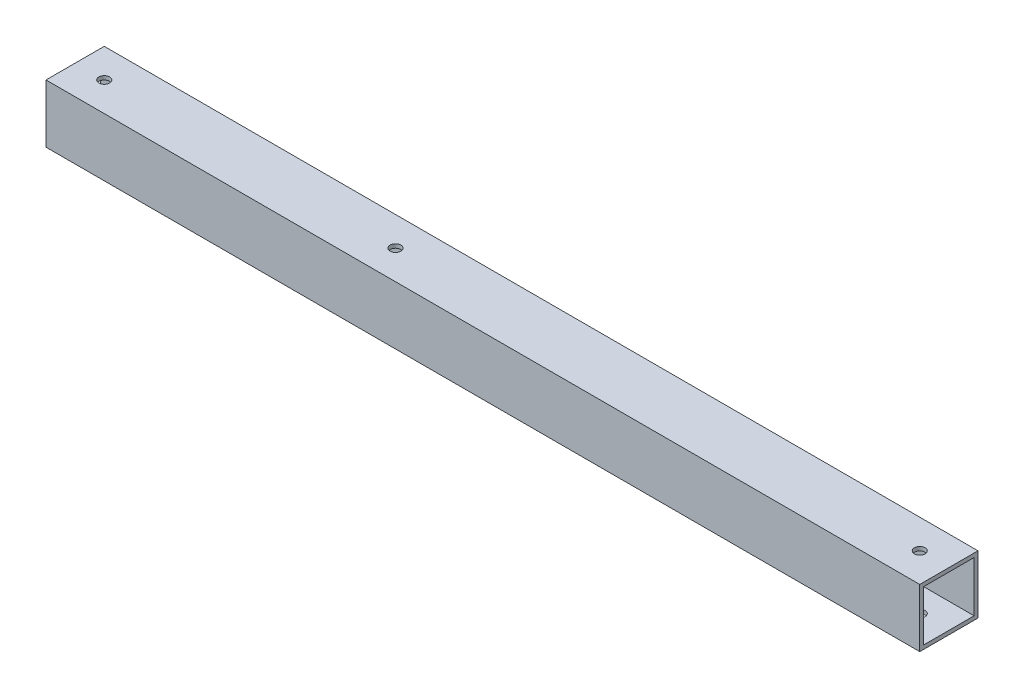
ISO-10303-21;
HEADER;
FILE_DESCRIPTION(('STEP AP214'),'2;1');
FILE_NAME('part.step','',(''),(''),'','','');
FILE_SCHEMA(('AUTOMOTIVE_DESIGN { 1 0 10303 214 1 1 1 1 }'));
ENDSEC;
DATA;
#1=APPLICATION_CONTEXT('core data for automotive mechanical design processes');
#2=APPLICATION_PROTOCOL_DEFINITION('international standard','automotive_design',2000,#1);
#3=PRODUCT_CONTEXT('',#1,'mechanical');
#4=PRODUCT('Part','Part','',(#3));
#5=PRODUCT_RELATED_PRODUCT_CATEGORY('part','',(#4));
#6=PRODUCT_DEFINITION_FORMATION('','',#4);
#7=PRODUCT_DEFINITION_CONTEXT('part definition',#1,'design');
#8=PRODUCT_DEFINITION('design','',#6,#7);
#9=PRODUCT_DEFINITION_SHAPE('','',#8);
#10=(LENGTH_UNIT() NAMED_UNIT(*) SI_UNIT(.MILLI.,.METRE.));
#11=(NAMED_UNIT(*) PLANE_ANGLE_UNIT() SI_UNIT($,.RADIAN.));
#12=(NAMED_UNIT(*) SI_UNIT($,.STERADIAN.) SOLID_ANGLE_UNIT());
#13=UNCERTAINTY_MEASURE_WITH_UNIT(LENGTH_MEASURE(1.E-05),#10,'distance_accuracy_value','');
#14=(GEOMETRIC_REPRESENTATION_CONTEXT(3) GLOBAL_UNCERTAINTY_ASSIGNED_CONTEXT((#13)) GLOBAL_UNIT_ASSIGNED_CONTEXT((#10,
#11,#12)) REPRESENTATION_CONTEXT('',''));
#15=CARTESIAN_POINT('',(0.,0.,0.));
#16=DIRECTION('',(0.,0.,1.));
#17=DIRECTION('',(1.,0.,0.));
#18=AXIS2_PLACEMENT_3D('',#15,#16,#17);
#19=CARTESIAN_POINT('',(225.,0.,0.));
#20=DIRECTION('',(-1.,0.,0.));
#21=DIRECTION('',(0.,0.,1.));
#22=AXIS2_PLACEMENT_3D('',#19,#20,#21);
#23=PLANE('',#22);
#24=DIRECTION('',(0.,-1.,0.));
#25=VECTOR('',#24,1.);
#26=CARTESIAN_POINT('',(225.,15.,15.));
#27=LINE('',#26,#25);
#28=CARTESIAN_POINT('',(225.,15.,15.));
#29=VERTEX_POINT('',#28);
#30=CARTESIAN_POINT('',(225.,-15.,15.));
#31=VERTEX_POINT('',#30);
#32=EDGE_CURVE('E156',#29,#31,#27,.T.);
#33=ORIENTED_EDGE('',*,*,#32,.T.);
#34=DIRECTION('',(0.,0.,-1.));
#35=VECTOR('',#34,1.);
#36=CARTESIAN_POINT('',(225.,-15.,-15.));
#37=LINE('',#36,#35);
#38=CARTESIAN_POINT('',(225.,-15.,-15.));
#39=VERTEX_POINT('',#38);
#40=EDGE_CURVE('E160',#31,#39,#37,.T.);
#41=ORIENTED_EDGE('',*,*,#40,.T.);
#42=DIRECTION('',(0.,1.,0.));
#43=VECTOR('',#42,1.);
#44=CARTESIAN_POINT('',(225.,15.,-15.));
#45=LINE('',#44,#43);
#46=CARTESIAN_POINT('',(225.,15.,-15.));
#47=VERTEX_POINT('',#46);
#48=EDGE_CURVE('E164',#39,#47,#45,.T.);
#49=ORIENTED_EDGE('',*,*,#48,.T.);
#50=DIRECTION('',(0.,0.,1.));
#51=VECTOR('',#50,1.);
#52=CARTESIAN_POINT('',(225.,15.,-15.));
#53=LINE('',#52,#51);
#54=EDGE_CURVE('E167',#47,#29,#53,.T.);
#55=ORIENTED_EDGE('',*,*,#54,.T.);
#56=EDGE_LOOP('',(#33,#41,#49,#55));
#57=FACE_BOUND('',#56,.T.);
#58=DIRECTION('',(0.,1.,0.));
#59=VECTOR('',#58,1.);
#60=CARTESIAN_POINT('',(225.,13.,-13.));
#61=LINE('',#60,#59);
#62=CARTESIAN_POINT('',(225.,-13.,-13.));
#63=VERTEX_POINT('',#62);
#64=CARTESIAN_POINT('',(225.,13.,-13.));
#65=VERTEX_POINT('',#64);
#66=EDGE_CURVE('E106',#63,#65,#61,.T.);
#67=ORIENTED_EDGE('',*,*,#66,.F.);
#68=DIRECTION('',(0.,0.,-1.));
#69=VECTOR('',#68,1.);
#70=CARTESIAN_POINT('',(225.,-13.,13.));
#71=LINE('',#70,#69);
#72=CARTESIAN_POINT('',(225.,-13.,13.));
#73=VERTEX_POINT('',#72);
#74=EDGE_CURVE('E132',#73,#63,#71,.T.);
#75=ORIENTED_EDGE('',*,*,#74,.F.);
#76=DIRECTION('',(0.,-1.,0.));
#77=VECTOR('',#76,1.);
#78=CARTESIAN_POINT('',(225.,13.,13.));
#79=LINE('',#78,#77);
#80=CARTESIAN_POINT('',(225.,13.,13.));
#81=VERTEX_POINT('',#80);
#82=EDGE_CURVE('E128',#81,#73,#79,.T.);
#83=ORIENTED_EDGE('',*,*,#82,.F.);
#84=DIRECTION('',(0.,0.,1.));
#85=VECTOR('',#84,1.);
#86=CARTESIAN_POINT('',(225.,13.,13.));
#87=LINE('',#86,#85);
#88=EDGE_CURVE('E115',#65,#81,#87,.T.);
#89=ORIENTED_EDGE('',*,*,#88,.F.);
#90=EDGE_LOOP('',(#67,#75,#83,#89));
#91=FACE_BOUND('',#90,.T.);
#92=ADVANCED_FACE('F38',(#57,#91),#23,.F.);
#93=CARTESIAN_POINT('',(-225.,0.,0.));
#94=DIRECTION('',(-1.,0.,0.));
#95=DIRECTION('',(0.,0.,1.));
#96=AXIS2_PLACEMENT_3D('',#93,#94,#95);
#97=PLANE('',#96);
#98=DIRECTION('',(0.,-1.,0.));
#99=VECTOR('',#98,1.);
#100=CARTESIAN_POINT('',(-225.,15.,15.));
#101=LINE('',#100,#99);
#102=CARTESIAN_POINT('',(-225.,15.,15.));
#103=VERTEX_POINT('',#102);
#104=CARTESIAN_POINT('',(-225.,-15.,15.));
#105=VERTEX_POINT('',#104);
#106=EDGE_CURVE('E124',#103,#105,#101,.T.);
#107=ORIENTED_EDGE('',*,*,#106,.F.);
#108=DIRECTION('',(0.,0.,1.));
#109=VECTOR('',#108,1.);
#110=CARTESIAN_POINT('',(-225.,15.,-15.));
#111=LINE('',#110,#109);
#112=CARTESIAN_POINT('',(-225.,15.,-15.));
#113=VERTEX_POINT('',#112);
#114=EDGE_CURVE('E161',#113,#103,#111,.T.);
#115=ORIENTED_EDGE('',*,*,#114,.F.);
#116=DIRECTION('',(0.,1.,0.));
#117=VECTOR('',#116,1.);
#118=CARTESIAN_POINT('',(-225.,15.,-15.));
#119=LINE('',#118,#117);
#120=CARTESIAN_POINT('',(-225.,-15.,-15.));
#121=VERTEX_POINT('',#120);
#122=EDGE_CURVE('E177',#121,#113,#119,.T.);
#123=ORIENTED_EDGE('',*,*,#122,.F.);
#124=DIRECTION('',(0.,0.,-1.));
#125=VECTOR('',#124,1.);
#126=CARTESIAN_POINT('',(-225.,-15.,-15.));
#127=LINE('',#126,#125);
#128=EDGE_CURVE('E174',#105,#121,#127,.T.);
#129=ORIENTED_EDGE('',*,*,#128,.F.);
#130=EDGE_LOOP('',(#107,#115,#123,#129));
#131=FACE_BOUND('',#130,.T.);
#132=DIRECTION('',(0.,0.,-1.));
#133=VECTOR('',#132,1.);
#134=CARTESIAN_POINT('',(-225.,-13.,13.));
#135=LINE('',#134,#133);
#136=CARTESIAN_POINT('',(-225.,-13.,13.));
#137=VERTEX_POINT('',#136);
#138=CARTESIAN_POINT('',(-225.,-13.,-13.));
#139=VERTEX_POINT('',#138);
#140=EDGE_CURVE('E116',#137,#139,#135,.T.);
#141=ORIENTED_EDGE('',*,*,#140,.T.);
#142=DIRECTION('',(0.,1.,0.));
#143=VECTOR('',#142,1.);
#144=CARTESIAN_POINT('',(-225.,13.,-13.));
#145=LINE('',#144,#143);
#146=CARTESIAN_POINT('',(-225.,13.,-13.));
#147=VERTEX_POINT('',#146);
#148=EDGE_CURVE('E64',#139,#147,#145,.T.);
#149=ORIENTED_EDGE('',*,*,#148,.T.);
#150=DIRECTION('',(0.,0.,1.));
#151=VECTOR('',#150,1.);
#152=CARTESIAN_POINT('',(-225.,13.,13.));
#153=LINE('',#152,#151);
#154=CARTESIAN_POINT('',(-225.,13.,13.));
#155=VERTEX_POINT('',#154);
#156=EDGE_CURVE('E122',#147,#155,#153,.T.);
#157=ORIENTED_EDGE('',*,*,#156,.T.);
#158=DIRECTION('',(0.,-1.,0.));
#159=VECTOR('',#158,1.);
#160=CARTESIAN_POINT('',(-225.,13.,13.));
#161=LINE('',#160,#159);
#162=EDGE_CURVE('E143',#155,#137,#161,.T.);
#163=ORIENTED_EDGE('',*,*,#162,.T.);
#164=EDGE_LOOP('',(#141,#149,#157,#163));
#165=FACE_BOUND('',#164,.T.);
#166=ADVANCED_FACE('F249',(#131,#165),#97,.T.);
#167=CARTESIAN_POINT('',(225.,15.,15.));
#168=DIRECTION('',(0.,0.,-1.));
#169=DIRECTION('',(0.,1.,0.));
#170=AXIS2_PLACEMENT_3D('',#167,#168,#169);
#171=PLANE('',#170);
#172=ORIENTED_EDGE('',*,*,#106,.T.);
#173=DIRECTION('',(-1.,0.,0.));
#174=VECTOR('',#173,1.);
#175=CARTESIAN_POINT('',(225.,-15.,15.));
#176=LINE('',#175,#174);
#177=EDGE_CURVE('E11',#31,#105,#176,.T.);
#178=ORIENTED_EDGE('',*,*,#177,.F.);
#179=ORIENTED_EDGE('',*,*,#32,.F.);
#180=DIRECTION('',(-1.,0.,0.));
#181=VECTOR('',#180,1.);
#182=CARTESIAN_POINT('',(225.,15.,15.));
#183=LINE('',#182,#181);
#184=EDGE_CURVE('E170',#29,#103,#183,.T.);
#185=ORIENTED_EDGE('',*,*,#184,.T.);
#186=EDGE_LOOP('',(#172,#178,#179,#185));
#187=FACE_BOUND('',#186,.T.);
#188=ADVANCED_FACE('F40',(#187),#171,.F.);
#189=CARTESIAN_POINT('',(225.,-15.,-15.));
#190=DIRECTION('',(0.,1.,0.));
#191=DIRECTION('',(0.,0.,1.));
#192=AXIS2_PLACEMENT_3D('',#189,#190,#191);
#193=PLANE('',#192);
#194=CARTESIAN_POINT('',(-60.,-15.,0.));
#195=DIRECTION('',(0.,1.,0.));
#196=DIRECTION('',(0.,0.,1.));
#197=AXIS2_PLACEMENT_3D('',#194,#195,#196);
#198=CIRCLE('',#197,2.74999999999999);
#199=CARTESIAN_POINT('',(-60.,-15.,2.74999999999999));
#200=VERTEX_POINT('',#199);
#201=EDGE_CURVE('E274',#200,#200,#198,.T.);
#202=ORIENTED_EDGE('',*,*,#201,.T.);
#203=EDGE_LOOP('',(#202));
#204=FACE_BOUND('',#203,.T.);
#205=CARTESIAN_POINT('',(-210.,-15.,0.));
#206=DIRECTION('',(0.,-1.,0.));
#207=DIRECTION('',(0.,0.,1.));
#208=AXIS2_PLACEMENT_3D('',#205,#206,#207);
#209=CIRCLE('',#208,2.75000000000001);
#210=CARTESIAN_POINT('',(-210.,-15.,2.75000000000001));
#211=VERTEX_POINT('',#210);
#212=EDGE_CURVE('E200',#211,#211,#209,.T.);
#213=ORIENTED_EDGE('',*,*,#212,.F.);
#214=EDGE_LOOP('',(#213));
#215=FACE_BOUND('',#214,.T.);
#216=CARTESIAN_POINT('',(210.,-15.,0.));
#217=DIRECTION('',(0.,1.,0.));
#218=DIRECTION('',(0.,0.,1.));
#219=AXIS2_PLACEMENT_3D('',#216,#217,#218);
#220=CIRCLE('',#219,2.75000000000001);
#221=CARTESIAN_POINT('',(210.,-15.,2.75000000000001));
#222=VERTEX_POINT('',#221);
#223=EDGE_CURVE('E195',#222,#222,#220,.T.);
#224=ORIENTED_EDGE('',*,*,#223,.T.);
#225=EDGE_LOOP('',(#224));
#226=FACE_BOUND('',#225,.T.);
#227=ORIENTED_EDGE('',*,*,#128,.T.);
#228=DIRECTION('',(-1.,0.,0.));
#229=VECTOR('',#228,1.);
#230=CARTESIAN_POINT('',(225.,-15.,-15.));
#231=LINE('',#230,#229);
#232=EDGE_CURVE('E48',#39,#121,#231,.T.);
#233=ORIENTED_EDGE('',*,*,#232,.F.);
#234=ORIENTED_EDGE('',*,*,#40,.F.);
#235=ORIENTED_EDGE('',*,*,#177,.T.);
#236=EDGE_LOOP('',(#227,#233,#234,#235));
#237=FACE_BOUND('',#236,.T.);
#238=ADVANCED_FACE('F262',(#204,#215,#226,#237),#193,.F.);
#239=CARTESIAN_POINT('',(225.,15.,-15.));
#240=DIRECTION('',(0.,0.,1.));
#241=DIRECTION('',(0.,-1.,0.));
#242=AXIS2_PLACEMENT_3D('',#239,#240,#241);
#243=PLANE('',#242);
#244=ORIENTED_EDGE('',*,*,#122,.T.);
#245=DIRECTION('',(-1.,0.,0.));
#246=VECTOR('',#245,1.);
#247=CARTESIAN_POINT('',(225.,15.,-15.));
#248=LINE('',#247,#246);
#249=EDGE_CURVE('E185',#47,#113,#248,.T.);
#250=ORIENTED_EDGE('',*,*,#249,.F.);
#251=ORIENTED_EDGE('',*,*,#48,.F.);
#252=ORIENTED_EDGE('',*,*,#232,.T.);
#253=EDGE_LOOP('',(#244,#250,#251,#252));
#254=FACE_BOUND('',#253,.T.);
#255=ADVANCED_FACE('F259',(#254),#243,.F.);
#256=CARTESIAN_POINT('',(225.,15.,-15.));
#257=DIRECTION('',(0.,-1.,0.));
#258=DIRECTION('',(0.,0.,-1.));
#259=AXIS2_PLACEMENT_3D('',#256,#257,#258);
#260=PLANE('',#259);
#261=CARTESIAN_POINT('',(-60.,15.,0.));
#262=DIRECTION('',(0.,1.,0.));
#263=DIRECTION('',(0.,0.,1.));
#264=AXIS2_PLACEMENT_3D('',#261,#262,#263);
#265=CIRCLE('',#264,2.74999999999999);
#266=CARTESIAN_POINT('',(-60.,15.,2.74999999999999));
#267=VERTEX_POINT('',#266);
#268=EDGE_CURVE('E319',#267,#267,#265,.T.);
#269=ORIENTED_EDGE('',*,*,#268,.F.);
#270=EDGE_LOOP('',(#269));
#271=FACE_BOUND('',#270,.T.);
#272=CARTESIAN_POINT('',(-210.,15.,0.));
#273=DIRECTION('',(0.,-1.,0.));
#274=DIRECTION('',(0.,0.,1.));
#275=AXIS2_PLACEMENT_3D('',#272,#273,#274);
#276=CIRCLE('',#275,2.75000000000001);
#277=CARTESIAN_POINT('',(-210.,15.,2.75000000000001));
#278=VERTEX_POINT('',#277);
#279=EDGE_CURVE('E209',#278,#278,#276,.T.);
#280=ORIENTED_EDGE('',*,*,#279,.T.);
#281=EDGE_LOOP('',(#280));
#282=FACE_BOUND('',#281,.T.);
#283=CARTESIAN_POINT('',(210.,15.,0.));
#284=DIRECTION('',(0.,1.,0.));
#285=DIRECTION('',(0.,0.,1.));
#286=AXIS2_PLACEMENT_3D('',#283,#284,#285);
#287=CIRCLE('',#286,2.75000000000001);
#288=CARTESIAN_POINT('',(210.,15.,2.75000000000001));
#289=VERTEX_POINT('',#288);
#290=EDGE_CURVE('E206',#289,#289,#287,.T.);
#291=ORIENTED_EDGE('',*,*,#290,.F.);
#292=EDGE_LOOP('',(#291));
#293=FACE_BOUND('',#292,.T.);
#294=ORIENTED_EDGE('',*,*,#114,.T.);
#295=ORIENTED_EDGE('',*,*,#184,.F.);
#296=ORIENTED_EDGE('',*,*,#54,.F.);
#297=ORIENTED_EDGE('',*,*,#249,.T.);
#298=EDGE_LOOP('',(#294,#295,#296,#297));
#299=FACE_BOUND('',#298,.T.);
#300=ADVANCED_FACE('F244',(#271,#282,#293,#299),#260,.F.);
#301=CARTESIAN_POINT('',(225.,13.,-13.));
#302=DIRECTION('',(0.,0.,1.));
#303=DIRECTION('',(1.,0.,0.));
#304=AXIS2_PLACEMENT_3D('',#301,#302,#303);
#305=PLANE('',#304);
#306=ORIENTED_EDGE('',*,*,#148,.F.);
#307=DIRECTION('',(-1.,0.,0.));
#308=VECTOR('',#307,1.);
#309=CARTESIAN_POINT('',(225.,-13.,-13.));
#310=LINE('',#309,#308);
#311=EDGE_CURVE('E110',#63,#139,#310,.T.);
#312=ORIENTED_EDGE('',*,*,#311,.F.);
#313=ORIENTED_EDGE('',*,*,#66,.T.);
#314=DIRECTION('',(-1.,0.,0.));
#315=VECTOR('',#314,1.);
#316=CARTESIAN_POINT('',(225.,13.,-13.));
#317=LINE('',#316,#315);
#318=EDGE_CURVE('E109',#65,#147,#317,.T.);
#319=ORIENTED_EDGE('',*,*,#318,.T.);
#320=EDGE_LOOP('',(#306,#312,#313,#319));
#321=FACE_BOUND('',#320,.T.);
#322=ADVANCED_FACE('F108',(#321),#305,.T.);
#323=CARTESIAN_POINT('',(225.,13.,13.));
#324=DIRECTION('',(0.,-1.,0.));
#325=DIRECTION('',(0.,0.,-1.));
#326=AXIS2_PLACEMENT_3D('',#323,#324,#325);
#327=PLANE('',#326);
#328=CARTESIAN_POINT('',(-60.,13.,0.));
#329=DIRECTION('',(0.,-1.,0.));
#330=DIRECTION('',(0.,0.,-1.));
#331=AXIS2_PLACEMENT_3D('',#328,#329,#330);
#332=CIRCLE('',#331,2.74999999999999);
#333=CARTESIAN_POINT('',(-60.,13.,-2.74999999999999));
#334=VERTEX_POINT('',#333);
#335=EDGE_CURVE('E215',#334,#334,#332,.T.);
#336=ORIENTED_EDGE('',*,*,#335,.F.);
#337=EDGE_LOOP('',(#336));
#338=FACE_BOUND('',#337,.T.);
#339=CARTESIAN_POINT('',(-210.,13.,0.));
#340=DIRECTION('',(0.,-1.,0.));
#341=DIRECTION('',(0.,0.,-1.));
#342=AXIS2_PLACEMENT_3D('',#339,#340,#341);
#343=CIRCLE('',#342,2.75000000000001);
#344=CARTESIAN_POINT('',(-210.,13.,-2.75000000000001));
#345=VERTEX_POINT('',#344);
#346=EDGE_CURVE('E199',#345,#345,#343,.F.);
#347=ORIENTED_EDGE('',*,*,#346,.T.);
#348=EDGE_LOOP('',(#347));
#349=FACE_BOUND('',#348,.T.);
#350=CARTESIAN_POINT('',(210.,13.,0.));
#351=DIRECTION('',(0.,-1.,0.));
#352=DIRECTION('',(0.,0.,-1.));
#353=AXIS2_PLACEMENT_3D('',#350,#351,#352);
#354=CIRCLE('',#353,2.75000000000001);
#355=CARTESIAN_POINT('',(210.,13.,-2.75000000000001));
#356=VERTEX_POINT('',#355);
#357=EDGE_CURVE('E140',#356,#356,#354,.T.);
#358=ORIENTED_EDGE('',*,*,#357,.F.);
#359=EDGE_LOOP('',(#358));
#360=FACE_BOUND('',#359,.T.);
#361=ORIENTED_EDGE('',*,*,#156,.F.);
#362=ORIENTED_EDGE('',*,*,#318,.F.);
#363=ORIENTED_EDGE('',*,*,#88,.T.);
#364=DIRECTION('',(-1.,0.,0.));
#365=VECTOR('',#364,1.);
#366=CARTESIAN_POINT('',(225.,13.,13.));
#367=LINE('',#366,#365);
#368=EDGE_CURVE('E125',#81,#155,#367,.T.);
#369=ORIENTED_EDGE('',*,*,#368,.T.);
#370=EDGE_LOOP('',(#361,#362,#363,#369));
#371=FACE_BOUND('',#370,.T.);
#372=ADVANCED_FACE('F119',(#338,#349,#360,#371),#327,.T.);
#373=CARTESIAN_POINT('',(225.,13.,13.));
#374=DIRECTION('',(0.,0.,-1.));
#375=DIRECTION('',(-1.,0.,0.));
#376=AXIS2_PLACEMENT_3D('',#373,#374,#375);
#377=PLANE('',#376);
#378=ORIENTED_EDGE('',*,*,#162,.F.);
#379=ORIENTED_EDGE('',*,*,#368,.F.);
#380=ORIENTED_EDGE('',*,*,#82,.T.);
#381=DIRECTION('',(-1.,0.,0.));
#382=VECTOR('',#381,1.);
#383=CARTESIAN_POINT('',(225.,-13.,13.));
#384=LINE('',#383,#382);
#385=EDGE_CURVE('E56',#73,#137,#384,.T.);
#386=ORIENTED_EDGE('',*,*,#385,.T.);
#387=EDGE_LOOP('',(#378,#379,#380,#386));
#388=FACE_BOUND('',#387,.T.);
#389=ADVANCED_FACE('F232',(#388),#377,.T.);
#390=CARTESIAN_POINT('',(225.,-13.,13.));
#391=DIRECTION('',(0.,1.,0.));
#392=DIRECTION('',(0.,0.,1.));
#393=AXIS2_PLACEMENT_3D('',#390,#391,#392);
#394=PLANE('',#393);
#395=CARTESIAN_POINT('',(-60.,-13.,0.));
#396=DIRECTION('',(0.,1.,0.));
#397=DIRECTION('',(0.,0.,1.));
#398=AXIS2_PLACEMENT_3D('',#395,#396,#397);
#399=CIRCLE('',#398,2.74999999999999);
#400=CARTESIAN_POINT('',(-60.,-13.,2.74999999999999));
#401=VERTEX_POINT('',#400);
#402=EDGE_CURVE('E42',#401,#401,#399,.T.);
#403=ORIENTED_EDGE('',*,*,#402,.F.);
#404=EDGE_LOOP('',(#403));
#405=FACE_BOUND('',#404,.T.);
#406=CARTESIAN_POINT('',(-210.,-13.,0.));
#407=DIRECTION('',(0.,1.,0.));
#408=DIRECTION('',(0.,0.,1.));
#409=AXIS2_PLACEMENT_3D('',#406,#407,#408);
#410=CIRCLE('',#409,2.75000000000001);
#411=CARTESIAN_POINT('',(-210.,-13.,2.75000000000001));
#412=VERTEX_POINT('',#411);
#413=EDGE_CURVE('E196',#412,#412,#410,.F.);
#414=ORIENTED_EDGE('',*,*,#413,.T.);
#415=EDGE_LOOP('',(#414));
#416=FACE_BOUND('',#415,.T.);
#417=CARTESIAN_POINT('',(210.,-13.,0.));
#418=DIRECTION('',(0.,1.,0.));
#419=DIRECTION('',(0.,0.,1.));
#420=AXIS2_PLACEMENT_3D('',#417,#418,#419);
#421=CIRCLE('',#420,2.75000000000001);
#422=CARTESIAN_POINT('',(210.,-13.,2.75000000000001));
#423=VERTEX_POINT('',#422);
#424=EDGE_CURVE('E192',#423,#423,#421,.T.);
#425=ORIENTED_EDGE('',*,*,#424,.F.);
#426=EDGE_LOOP('',(#425));
#427=FACE_BOUND('',#426,.T.);
#428=ORIENTED_EDGE('',*,*,#140,.F.);
#429=ORIENTED_EDGE('',*,*,#385,.F.);
#430=ORIENTED_EDGE('',*,*,#74,.T.);
#431=ORIENTED_EDGE('',*,*,#311,.T.);
#432=EDGE_LOOP('',(#428,#429,#430,#431));
#433=FACE_BOUND('',#432,.T.);
#434=ADVANCED_FACE('F240',(#405,#416,#427,#433),#394,.T.);
#435=CARTESIAN_POINT('',(210.,-15.,0.));
#436=DIRECTION('',(0.,1.,0.));
#437=DIRECTION('',(0.,0.,1.));
#438=AXIS2_PLACEMENT_3D('',#435,#436,#437);
#439=CYLINDRICAL_SURFACE('',#438,2.75000000000001);
#440=ORIENTED_EDGE('',*,*,#424,.T.);
#441=EDGE_LOOP('',(#440));
#442=FACE_BOUND('',#441,.T.);
#443=ORIENTED_EDGE('',*,*,#223,.F.);
#444=EDGE_LOOP('',(#443));
#445=FACE_BOUND('',#444,.T.);
#446=ADVANCED_FACE('F291',(#442,#445),#439,.F.);
#447=ORIENTED_EDGE('',*,*,#357,.T.);
#448=EDGE_LOOP('',(#447));
#449=FACE_BOUND('',#448,.T.);
#450=ORIENTED_EDGE('',*,*,#290,.T.);
#451=EDGE_LOOP('',(#450));
#452=FACE_BOUND('',#451,.T.);
#453=ADVANCED_FACE('F228',(#449,#452),#439,.F.);
#454=CARTESIAN_POINT('',(-210.,-15.,0.));
#455=DIRECTION('',(0.,1.,0.));
#456=DIRECTION('',(0.,0.,1.));
#457=AXIS2_PLACEMENT_3D('',#454,#455,#456);
#458=CYLINDRICAL_SURFACE('',#457,2.75000000000001);
#459=ORIENTED_EDGE('',*,*,#413,.F.);
#460=EDGE_LOOP('',(#459));
#461=FACE_BOUND('',#460,.T.);
#462=ORIENTED_EDGE('',*,*,#212,.T.);
#463=EDGE_LOOP('',(#462));
#464=FACE_BOUND('',#463,.T.);
#465=ADVANCED_FACE('F302',(#461,#464),#458,.F.);
#466=ORIENTED_EDGE('',*,*,#346,.F.);
#467=EDGE_LOOP('',(#466));
#468=FACE_BOUND('',#467,.T.);
#469=ORIENTED_EDGE('',*,*,#279,.F.);
#470=EDGE_LOOP('',(#469));
#471=FACE_BOUND('',#470,.T.);
#472=ADVANCED_FACE('F305',(#468,#471),#458,.F.);
#473=CARTESIAN_POINT('',(-60.,-15.,0.));
#474=DIRECTION('',(0.,1.,0.));
#475=DIRECTION('',(0.,0.,1.));
#476=AXIS2_PLACEMENT_3D('',#473,#474,#475);
#477=CYLINDRICAL_SURFACE('',#476,2.74999999999999);
#478=ORIENTED_EDGE('',*,*,#402,.T.);
#479=EDGE_LOOP('',(#478));
#480=FACE_BOUND('',#479,.T.);
#481=ORIENTED_EDGE('',*,*,#201,.F.);
#482=EDGE_LOOP('',(#481));
#483=FACE_BOUND('',#482,.T.);
#484=ADVANCED_FACE('F307',(#480,#483),#477,.F.);
#485=ORIENTED_EDGE('',*,*,#335,.T.);
#486=EDGE_LOOP('',(#485));
#487=FACE_BOUND('',#486,.T.);
#488=ORIENTED_EDGE('',*,*,#268,.T.);
#489=EDGE_LOOP('',(#488));
#490=FACE_BOUND('',#489,.T.);
#491=ADVANCED_FACE('F309',(#487,#490),#477,.F.);
#492=CLOSED_SHELL('',(#92,#166,#188,#238,#255,#300,#322,#372,#389,#434,#446,#453,#465,#472,#484,#491));
#493=MANIFOLD_SOLID_BREP('B2',#492);
#494=ADVANCED_BREP_SHAPE_REPRESENTATION('',(#18,#493),#14);
#495=SHAPE_DEFINITION_REPRESENTATION(#9,#494);
ENDSEC;
END-ISO-10303-21;
